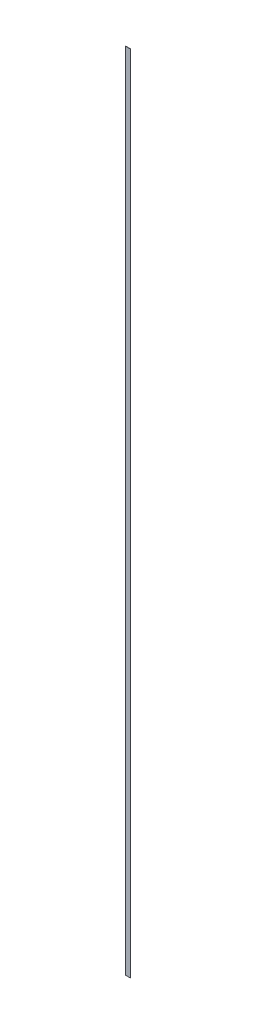
ISO-10303-21;
HEADER;
FILE_DESCRIPTION(('STEP AP214'),'2;1');
FILE_NAME('part.step','',(''),(''),'','','');
FILE_SCHEMA(('AUTOMOTIVE_DESIGN { 1 0 10303 214 1 1 1 1 }'));
ENDSEC;
DATA;
#1=APPLICATION_CONTEXT('core data for automotive mechanical design processes');
#2=APPLICATION_PROTOCOL_DEFINITION('international standard','automotive_design',2000,#1);
#3=PRODUCT_CONTEXT('',#1,'mechanical');
#4=PRODUCT('Part','Part','',(#3));
#5=PRODUCT_RELATED_PRODUCT_CATEGORY('part','',(#4));
#6=PRODUCT_DEFINITION_FORMATION('','',#4);
#7=PRODUCT_DEFINITION_CONTEXT('part definition',#1,'design');
#8=PRODUCT_DEFINITION('design','',#6,#7);
#9=PRODUCT_DEFINITION_SHAPE('','',#8);
#10=(LENGTH_UNIT() NAMED_UNIT(*) SI_UNIT(.MILLI.,.METRE.));
#11=(NAMED_UNIT(*) PLANE_ANGLE_UNIT() SI_UNIT($,.RADIAN.));
#12=(NAMED_UNIT(*) SI_UNIT($,.STERADIAN.) SOLID_ANGLE_UNIT());
#13=UNCERTAINTY_MEASURE_WITH_UNIT(LENGTH_MEASURE(1.E-05),#10,'distance_accuracy_value','');
#14=(GEOMETRIC_REPRESENTATION_CONTEXT(3) GLOBAL_UNCERTAINTY_ASSIGNED_CONTEXT((#13)) GLOBAL_UNIT_ASSIGNED_CONTEXT((#10,
#11,#12)) REPRESENTATION_CONTEXT('',''));
#15=CARTESIAN_POINT('',(0.,0.,0.));
#16=DIRECTION('',(0.,0.,1.));
#17=DIRECTION('',(1.,0.,0.));
#18=AXIS2_PLACEMENT_3D('',#15,#16,#17);
#19=CARTESIAN_POINT('',(26.0366091075329,-4082.669,0.));
#20=DIRECTION('',(1.,0.,0.));
#21=DIRECTION('',(0.,0.,-1.));
#22=AXIS2_PLACEMENT_3D('',#19,#20,#21);
#23=PLANE('',#22);
#24=DIRECTION('',(0.,-1.,0.));
#25=VECTOR('',#24,1.);
#26=CARTESIAN_POINT('',(26.0366091075339,4082.669,0.));
#27=LINE('',#26,#25);
#28=CARTESIAN_POINT('',(26.0366091075339,4082.669,0.));
#29=VERTEX_POINT('',#28);
#30=CARTESIAN_POINT('',(26.0366091075329,-4082.669,0.));
#31=VERTEX_POINT('',#30);
#32=EDGE_CURVE('E34',#29,#31,#27,.T.);
#33=ORIENTED_EDGE('',*,*,#32,.F.);
#34=DIRECTION('',(0.,0.,1.));
#35=VECTOR('',#34,1.);
#36=CARTESIAN_POINT('',(26.0366091075339,4082.669,0.));
#37=LINE('',#36,#35);
#38=CARTESIAN_POINT('',(26.0366091075339,4082.669,2.54));
#39=VERTEX_POINT('',#38);
#40=EDGE_CURVE('E10',#29,#39,#37,.T.);
#41=ORIENTED_EDGE('',*,*,#40,.T.);
#42=DIRECTION('',(0.,1.,0.));
#43=VECTOR('',#42,1.);
#44=CARTESIAN_POINT('',(26.0366091075329,-4082.669,2.54));
#45=LINE('',#44,#43);
#46=CARTESIAN_POINT('',(26.0366091075329,-4082.669,2.54));
#47=VERTEX_POINT('',#46);
#48=EDGE_CURVE('E78',#47,#39,#45,.T.);
#49=ORIENTED_EDGE('',*,*,#48,.F.);
#50=DIRECTION('',(0.,0.,1.));
#51=VECTOR('',#50,1.);
#52=CARTESIAN_POINT('',(26.0366091075329,-4082.669,0.));
#53=LINE('',#52,#51);
#54=EDGE_CURVE('E26',#31,#47,#53,.T.);
#55=ORIENTED_EDGE('',*,*,#54,.F.);
#56=EDGE_LOOP('',(#33,#41,#49,#55));
#57=FACE_BOUND('',#56,.T.);
#58=ADVANCED_FACE('F16',(#57),#23,.T.);
#59=CARTESIAN_POINT('',(-24.7633908924671,-4082.669,0.));
#60=DIRECTION('',(0.,-1.,0.));
#61=DIRECTION('',(0.,0.,-1.));
#62=AXIS2_PLACEMENT_3D('',#59,#60,#61);
#63=PLANE('',#62);
#64=DIRECTION('',(-1.,0.,0.));
#65=VECTOR('',#64,1.);
#66=CARTESIAN_POINT('',(26.0366091075329,-4082.669,0.));
#67=LINE('',#66,#65);
#68=CARTESIAN_POINT('',(-24.7633908924671,-4082.669,0.));
#69=VERTEX_POINT('',#68);
#70=EDGE_CURVE('E81',#31,#69,#67,.T.);
#71=ORIENTED_EDGE('',*,*,#70,.F.);
#72=ORIENTED_EDGE('',*,*,#54,.T.);
#73=DIRECTION('',(1.,0.,0.));
#74=VECTOR('',#73,1.);
#75=CARTESIAN_POINT('',(-24.7633908924671,-4082.669,2.54));
#76=LINE('',#75,#74);
#77=CARTESIAN_POINT('',(-24.7633908924671,-4082.669,2.54));
#78=VERTEX_POINT('',#77);
#79=EDGE_CURVE('E70',#78,#47,#76,.T.);
#80=ORIENTED_EDGE('',*,*,#79,.F.);
#81=DIRECTION('',(0.,0.,1.));
#82=VECTOR('',#81,1.);
#83=CARTESIAN_POINT('',(-24.7633908924671,-4082.669,0.));
#84=LINE('',#83,#82);
#85=EDGE_CURVE('E66',#69,#78,#84,.T.);
#86=ORIENTED_EDGE('',*,*,#85,.F.);
#87=EDGE_LOOP('',(#71,#72,#80,#86));
#88=FACE_BOUND('',#87,.T.);
#89=ADVANCED_FACE('F90',(#88),#63,.T.);
#90=CARTESIAN_POINT('',(-24.7633908924663,4082.669,0.));
#91=DIRECTION('',(-1.,0.,0.));
#92=DIRECTION('',(0.,0.,1.));
#93=AXIS2_PLACEMENT_3D('',#90,#91,#92);
#94=PLANE('',#93);
#95=DIRECTION('',(0.,1.,0.));
#96=VECTOR('',#95,1.);
#97=CARTESIAN_POINT('',(-24.7633908924671,-4082.669,0.));
#98=LINE('',#97,#96);
#99=CARTESIAN_POINT('',(-24.7633908924663,4082.669,0.));
#100=VERTEX_POINT('',#99);
#101=EDGE_CURVE('E54',#69,#100,#98,.T.);
#102=ORIENTED_EDGE('',*,*,#101,.F.);
#103=ORIENTED_EDGE('',*,*,#85,.T.);
#104=DIRECTION('',(0.,-1.,0.));
#105=VECTOR('',#104,1.);
#106=CARTESIAN_POINT('',(-24.7633908924663,4082.669,2.54));
#107=LINE('',#106,#105);
#108=CARTESIAN_POINT('',(-24.7633908924663,4082.669,2.54));
#109=VERTEX_POINT('',#108);
#110=EDGE_CURVE('E60',#109,#78,#107,.T.);
#111=ORIENTED_EDGE('',*,*,#110,.F.);
#112=DIRECTION('',(0.,0.,1.));
#113=VECTOR('',#112,1.);
#114=CARTESIAN_POINT('',(-24.7633908924663,4082.669,0.));
#115=LINE('',#114,#113);
#116=EDGE_CURVE('E63',#100,#109,#115,.T.);
#117=ORIENTED_EDGE('',*,*,#116,.F.);
#118=EDGE_LOOP('',(#102,#103,#111,#117));
#119=FACE_BOUND('',#118,.T.);
#120=ADVANCED_FACE('F62',(#119),#94,.T.);
#121=CARTESIAN_POINT('',(26.0366091075339,4082.669,0.));
#122=DIRECTION('',(0.,1.,0.));
#123=DIRECTION('',(0.,0.,1.));
#124=AXIS2_PLACEMENT_3D('',#121,#122,#123);
#125=PLANE('',#124);
#126=DIRECTION('',(1.,0.,0.));
#127=VECTOR('',#126,1.);
#128=CARTESIAN_POINT('',(-24.7633908924663,4082.669,0.));
#129=LINE('',#128,#127);
#130=EDGE_CURVE('E75',#100,#29,#129,.T.);
#131=ORIENTED_EDGE('',*,*,#130,.F.);
#132=ORIENTED_EDGE('',*,*,#116,.T.);
#133=DIRECTION('',(-1.,0.,0.));
#134=VECTOR('',#133,1.);
#135=CARTESIAN_POINT('',(26.0366091075339,4082.669,2.54));
#136=LINE('',#135,#134);
#137=EDGE_CURVE('E20',#39,#109,#136,.T.);
#138=ORIENTED_EDGE('',*,*,#137,.F.);
#139=ORIENTED_EDGE('',*,*,#40,.F.);
#140=EDGE_LOOP('',(#131,#132,#138,#139));
#141=FACE_BOUND('',#140,.T.);
#142=ADVANCED_FACE('F74',(#141),#125,.T.);
#143=CARTESIAN_POINT('',(0.636609107533366,6.14548174E-13,2.54));
#144=DIRECTION('',(0.,0.,1.));
#145=DIRECTION('',(1.,0.,0.));
#146=AXIS2_PLACEMENT_3D('',#143,#144,#145);
#147=PLANE('',#146);
#148=ORIENTED_EDGE('',*,*,#137,.T.);
#149=ORIENTED_EDGE('',*,*,#110,.T.);
#150=ORIENTED_EDGE('',*,*,#79,.T.);
#151=ORIENTED_EDGE('',*,*,#48,.T.);
#152=EDGE_LOOP('',(#148,#149,#150,#151));
#153=FACE_BOUND('',#152,.T.);
#154=ADVANCED_FACE('F77',(#153),#147,.T.);
#155=CARTESIAN_POINT('',(0.636609107533366,6.14548174E-13,0.));
#156=DIRECTION('',(0.,0.,1.));
#157=DIRECTION('',(1.,0.,0.));
#158=AXIS2_PLACEMENT_3D('',#155,#156,#157);
#159=PLANE('',#158);
#160=ORIENTED_EDGE('',*,*,#130,.T.);
#161=ORIENTED_EDGE('',*,*,#32,.T.);
#162=ORIENTED_EDGE('',*,*,#70,.T.);
#163=ORIENTED_EDGE('',*,*,#101,.T.);
#164=EDGE_LOOP('',(#160,#161,#162,#163));
#165=FACE_BOUND('',#164,.T.);
#166=ADVANCED_FACE('F18',(#165),#159,.F.);
#167=CLOSED_SHELL('',(#58,#89,#120,#142,#154,#166));
#168=MANIFOLD_SOLID_BREP('B1',#167);
#169=ADVANCED_BREP_SHAPE_REPRESENTATION('',(#18,#168),#14);
#170=SHAPE_DEFINITION_REPRESENTATION(#9,#169);
ENDSEC;
END-ISO-10303-21;
